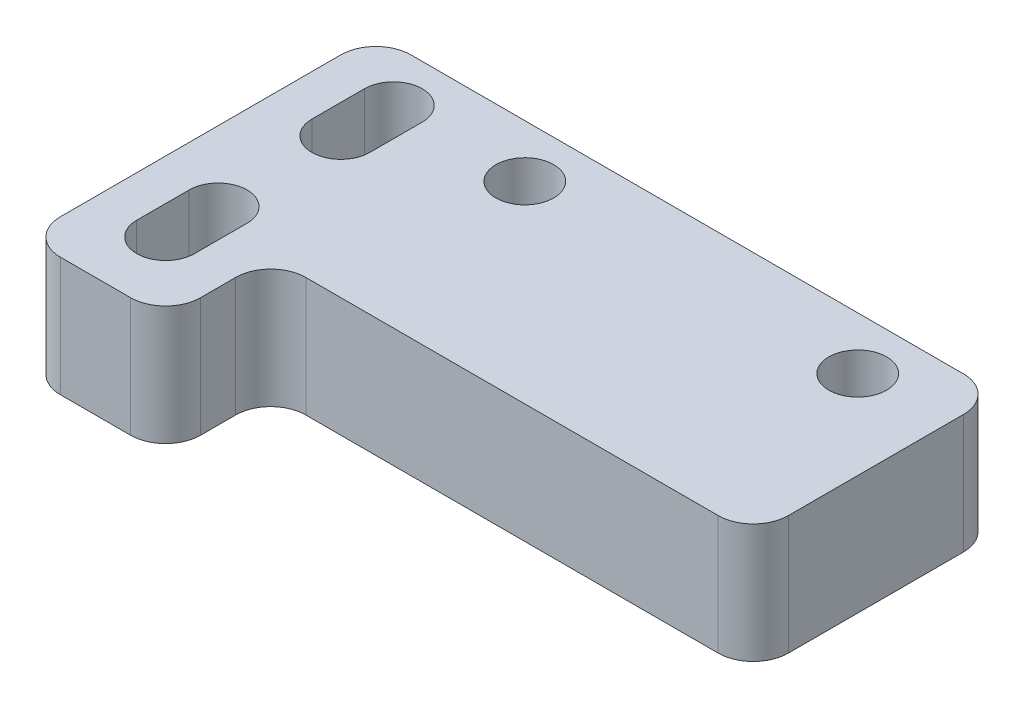
ISO-10303-21;
HEADER;
FILE_DESCRIPTION(('STEP AP214'),'2;1');
FILE_NAME('part.step','',(''),(''),'','','');
FILE_SCHEMA(('AUTOMOTIVE_DESIGN { 1 0 10303 214 1 1 1 1 }'));
ENDSEC;
DATA;
#1=APPLICATION_CONTEXT('core data for automotive mechanical design processes');
#2=APPLICATION_PROTOCOL_DEFINITION('international standard','automotive_design',2000,#1);
#3=PRODUCT_CONTEXT('',#1,'mechanical');
#4=PRODUCT('Part','Part','',(#3));
#5=PRODUCT_RELATED_PRODUCT_CATEGORY('part','',(#4));
#6=PRODUCT_DEFINITION_FORMATION('','',#4);
#7=PRODUCT_DEFINITION_CONTEXT('part definition',#1,'design');
#8=PRODUCT_DEFINITION('design','',#6,#7);
#9=PRODUCT_DEFINITION_SHAPE('','',#8);
#10=(LENGTH_UNIT() NAMED_UNIT(*) SI_UNIT(.MILLI.,.METRE.));
#11=(NAMED_UNIT(*) PLANE_ANGLE_UNIT() SI_UNIT($,.RADIAN.));
#12=(NAMED_UNIT(*) SI_UNIT($,.STERADIAN.) SOLID_ANGLE_UNIT());
#13=UNCERTAINTY_MEASURE_WITH_UNIT(LENGTH_MEASURE(1.E-05),#10,'distance_accuracy_value','');
#14=(GEOMETRIC_REPRESENTATION_CONTEXT(3) GLOBAL_UNCERTAINTY_ASSIGNED_CONTEXT((#13)) GLOBAL_UNIT_ASSIGNED_CONTEXT((#10,
#11,#12)) REPRESENTATION_CONTEXT('',''));
#15=CARTESIAN_POINT('',(0.,0.,0.));
#16=DIRECTION('',(0.,0.,1.));
#17=DIRECTION('',(1.,0.,0.));
#18=AXIS2_PLACEMENT_3D('',#15,#16,#17);
#19=CARTESIAN_POINT('',(0.,-3.4,8.));
#20=DIRECTION('',(0.,1.,0.));
#21=DIRECTION('',(0.,0.,1.));
#22=AXIS2_PLACEMENT_3D('',#19,#20,#21);
#23=PLANE('',#22);
#24=CARTESIAN_POINT('',(8.73,-3.4,-3.00000000000006));
#25=DIRECTION('',(0.,1.,0.));
#26=DIRECTION('',(0.,0.,1.));
#27=AXIS2_PLACEMENT_3D('',#24,#25,#26);
#28=CIRCLE('',#27,1.65);
#29=CARTESIAN_POINT('',(8.73,-3.4,-1.35000000000006));
#30=VERTEX_POINT('',#29);
#31=EDGE_CURVE('E279',#30,#30,#28,.T.);
#32=ORIENTED_EDGE('',*,*,#31,.T.);
#33=EDGE_LOOP('',(#32));
#34=FACE_BOUND('',#33,.T.);
#35=CARTESIAN_POINT('',(-10.27,-3.4,-3.00000000000007));
#36=DIRECTION('',(0.,1.,0.));
#37=DIRECTION('',(0.,0.,1.));
#38=AXIS2_PLACEMENT_3D('',#35,#36,#37);
#39=CIRCLE('',#38,1.65);
#40=CARTESIAN_POINT('',(-10.27,-3.4,-1.35000000000007));
#41=VERTEX_POINT('',#40);
#42=EDGE_CURVE('E270',#41,#41,#39,.T.);
#43=ORIENTED_EDGE('',*,*,#42,.T.);
#44=EDGE_LOOP('',(#43));
#45=FACE_BOUND('',#44,.T.);
#46=DIRECTION('',(0.,0.,1.));
#47=VECTOR('',#46,1.);
#48=CARTESIAN_POINT('',(-13.77,-3.4,-6.));
#49=LINE('',#48,#47);
#50=CARTESIAN_POINT('',(-13.77,-3.4,10.));
#51=VERTEX_POINT('',#50);
#52=CARTESIAN_POINT('',(-13.77,-3.4,12.));
#53=VERTEX_POINT('',#52);
#54=EDGE_CURVE('E391',#51,#53,#49,.T.);
#55=ORIENTED_EDGE('',*,*,#54,.T.);
#56=CARTESIAN_POINT('',(-15.77,-3.4,12.));
#57=DIRECTION('',(0.,1.,0.));
#58=DIRECTION('',(0.,0.,1.));
#59=AXIS2_PLACEMENT_3D('',#56,#57,#58);
#60=CIRCLE('',#59,2.);
#61=CARTESIAN_POINT('',(-15.77,-3.4,14.));
#62=VERTEX_POINT('',#61);
#63=EDGE_CURVE('E353',#53,#62,#60,.F.);
#64=ORIENTED_EDGE('',*,*,#63,.T.);
#65=DIRECTION('',(-1.,0.,0.));
#66=VECTOR('',#65,1.);
#67=CARTESIAN_POINT('',(-13.77,-3.4,14.));
#68=LINE('',#67,#66);
#69=CARTESIAN_POINT('',(-19.77,-3.4,14.));
#70=VERTEX_POINT('',#69);
#71=EDGE_CURVE('E398',#62,#70,#68,.T.);
#72=ORIENTED_EDGE('',*,*,#71,.T.);
#73=CARTESIAN_POINT('',(-19.77,-3.4,12.));
#74=DIRECTION('',(0.,1.,0.));
#75=DIRECTION('',(0.,0.,1.));
#76=AXIS2_PLACEMENT_3D('',#73,#74,#75);
#77=CIRCLE('',#76,2.);
#78=CARTESIAN_POINT('',(-21.77,-3.4,12.));
#79=VERTEX_POINT('',#78);
#80=EDGE_CURVE('E350',#70,#79,#77,.F.);
#81=ORIENTED_EDGE('',*,*,#80,.T.);
#82=DIRECTION('',(0.,0.,-1.));
#83=VECTOR('',#82,1.);
#84=CARTESIAN_POINT('',(-21.77,-3.4,-6.));
#85=LINE('',#84,#83);
#86=CARTESIAN_POINT('',(-21.77,-3.4,-4.));
#87=VERTEX_POINT('',#86);
#88=EDGE_CURVE('E406',#79,#87,#85,.T.);
#89=ORIENTED_EDGE('',*,*,#88,.T.);
#90=CARTESIAN_POINT('',(-19.77,-3.4,-4.));
#91=DIRECTION('',(0.,1.,0.));
#92=DIRECTION('',(0.,0.,1.));
#93=AXIS2_PLACEMENT_3D('',#90,#91,#92);
#94=CIRCLE('',#93,2.);
#95=CARTESIAN_POINT('',(-19.77,-3.4,-6.));
#96=VERTEX_POINT('',#95);
#97=EDGE_CURVE('E347',#87,#96,#94,.F.);
#98=ORIENTED_EDGE('',*,*,#97,.T.);
#99=DIRECTION('',(-1.,0.,0.));
#100=VECTOR('',#99,1.);
#101=CARTESIAN_POINT('',(13.77,-3.4,-6.));
#102=LINE('',#101,#100);
#103=CARTESIAN_POINT('',(11.77,-3.4,-6.));
#104=VERTEX_POINT('',#103);
#105=EDGE_CURVE('E283',#104,#96,#102,.T.);
#106=ORIENTED_EDGE('',*,*,#105,.F.);
#107=CARTESIAN_POINT('',(11.77,-3.4,-4.));
#108=DIRECTION('',(0.,1.,0.));
#109=DIRECTION('',(0.,0.,1.));
#110=AXIS2_PLACEMENT_3D('',#107,#108,#109);
#111=CIRCLE('',#110,2.);
#112=CARTESIAN_POINT('',(13.77,-3.4,-4.));
#113=VERTEX_POINT('',#112);
#114=EDGE_CURVE('E58',#104,#113,#111,.F.);
#115=ORIENTED_EDGE('',*,*,#114,.T.);
#116=DIRECTION('',(0.,0.,-1.));
#117=VECTOR('',#116,1.);
#118=CARTESIAN_POINT('',(13.77,-3.4,8.));
#119=LINE('',#118,#117);
#120=CARTESIAN_POINT('',(13.77,-3.4,6.));
#121=VERTEX_POINT('',#120);
#122=EDGE_CURVE('E303',#121,#113,#119,.T.);
#123=ORIENTED_EDGE('',*,*,#122,.F.);
#124=CARTESIAN_POINT('',(11.77,-3.4,6.));
#125=DIRECTION('',(0.,1.,0.));
#126=DIRECTION('',(0.,0.,1.));
#127=AXIS2_PLACEMENT_3D('',#124,#125,#126);
#128=CIRCLE('',#127,2.);
#129=CARTESIAN_POINT('',(11.77,-3.4,8.));
#130=VERTEX_POINT('',#129);
#131=EDGE_CURVE('E342',#121,#130,#128,.F.);
#132=ORIENTED_EDGE('',*,*,#131,.T.);
#133=DIRECTION('',(1.,0.,0.));
#134=VECTOR('',#133,1.);
#135=CARTESIAN_POINT('',(0.,-3.4,8.));
#136=LINE('',#135,#134);
#137=CARTESIAN_POINT('',(-11.77,-3.4,8.));
#138=VERTEX_POINT('',#137);
#139=EDGE_CURVE('E291',#138,#130,#136,.T.);
#140=ORIENTED_EDGE('',*,*,#139,.F.);
#141=CARTESIAN_POINT('',(-11.77,-3.4,10.));
#142=DIRECTION('',(0.,1.,0.));
#143=DIRECTION('',(0.,0.,1.));
#144=AXIS2_PLACEMENT_3D('',#141,#142,#143);
#145=CIRCLE('',#144,2.);
#146=EDGE_CURVE('E11',#138,#51,#145,.T.);
#147=ORIENTED_EDGE('',*,*,#146,.T.);
#148=EDGE_LOOP('',(#55,#64,#72,#81,#89,#98,#106,#115,#123,#132,#140,#147));
#149=FACE_BOUND('',#148,.T.);
#150=DIRECTION('',(0.,0.,-1.));
#151=VECTOR('',#150,1.);
#152=CARTESIAN_POINT('',(-19.42,-3.4,7.));
#153=LINE('',#152,#151);
#154=CARTESIAN_POINT('',(-19.42,-3.4,10.));
#155=VERTEX_POINT('',#154);
#156=CARTESIAN_POINT('',(-19.42,-3.4,7.));
#157=VERTEX_POINT('',#156);
#158=EDGE_CURVE('E262',#155,#157,#153,.T.);
#159=ORIENTED_EDGE('',*,*,#158,.F.);
#160=CARTESIAN_POINT('',(-17.77,-3.4,10.));
#161=DIRECTION('',(0.,1.,0.));
#162=DIRECTION('',(0.,0.,1.));
#163=AXIS2_PLACEMENT_3D('',#160,#161,#162);
#164=CIRCLE('',#163,1.65);
#165=CARTESIAN_POINT('',(-16.12,-3.4,10.));
#166=VERTEX_POINT('',#165);
#167=EDGE_CURVE('E188',#166,#155,#164,.F.);
#168=ORIENTED_EDGE('',*,*,#167,.F.);
#169=DIRECTION('',(0.,0.,1.));
#170=VECTOR('',#169,1.);
#171=CARTESIAN_POINT('',(-16.12,-3.4,7.));
#172=LINE('',#171,#170);
#173=CARTESIAN_POINT('',(-16.12,-3.4,7.));
#174=VERTEX_POINT('',#173);
#175=EDGE_CURVE('E403',#174,#166,#172,.T.);
#176=ORIENTED_EDGE('',*,*,#175,.F.);
#177=CARTESIAN_POINT('',(-17.77,-3.4,7.));
#178=DIRECTION('',(0.,1.,0.));
#179=DIRECTION('',(0.,0.,1.));
#180=AXIS2_PLACEMENT_3D('',#177,#178,#179);
#181=CIRCLE('',#180,1.65);
#182=EDGE_CURVE('E397',#157,#174,#181,.F.);
#183=ORIENTED_EDGE('',*,*,#182,.F.);
#184=EDGE_LOOP('',(#159,#168,#176,#183));
#185=FACE_BOUND('',#184,.T.);
#186=DIRECTION('',(0.,0.,-1.));
#187=VECTOR('',#186,1.);
#188=CARTESIAN_POINT('',(-19.42,-3.4,-3.));
#189=LINE('',#188,#187);
#190=CARTESIAN_POINT('',(-19.42,-3.4,0.));
#191=VERTEX_POINT('',#190);
#192=CARTESIAN_POINT('',(-19.42,-3.4,-3.));
#193=VERTEX_POINT('',#192);
#194=EDGE_CURVE('E265',#191,#193,#189,.T.);
#195=ORIENTED_EDGE('',*,*,#194,.F.);
#196=CARTESIAN_POINT('',(-17.77,-3.4,0.));
#197=DIRECTION('',(0.,1.,0.));
#198=DIRECTION('',(0.,0.,1.));
#199=AXIS2_PLACEMENT_3D('',#196,#197,#198);
#200=CIRCLE('',#199,1.65);
#201=CARTESIAN_POINT('',(-16.12,-3.4,0.));
#202=VERTEX_POINT('',#201);
#203=EDGE_CURVE('E275',#202,#191,#200,.F.);
#204=ORIENTED_EDGE('',*,*,#203,.F.);
#205=DIRECTION('',(0.,0.,1.));
#206=VECTOR('',#205,1.);
#207=CARTESIAN_POINT('',(-16.12,-3.4,-3.));
#208=LINE('',#207,#206);
#209=CARTESIAN_POINT('',(-16.12,-3.4,-3.));
#210=VERTEX_POINT('',#209);
#211=EDGE_CURVE('E428',#210,#202,#208,.T.);
#212=ORIENTED_EDGE('',*,*,#211,.F.);
#213=CARTESIAN_POINT('',(-17.77,-3.4,-3.));
#214=DIRECTION('',(0.,1.,0.));
#215=DIRECTION('',(0.,0.,1.));
#216=AXIS2_PLACEMENT_3D('',#213,#214,#215);
#217=CIRCLE('',#216,1.65);
#218=EDGE_CURVE('E419',#193,#210,#217,.F.);
#219=ORIENTED_EDGE('',*,*,#218,.F.);
#220=EDGE_LOOP('',(#195,#204,#212,#219));
#221=FACE_BOUND('',#220,.T.);
#222=ADVANCED_FACE('F42',(#34,#45,#149,#185,#221),#23,.F.);
#223=CARTESIAN_POINT('',(13.77,0.,8.));
#224=DIRECTION('',(-1.,0.,0.));
#225=DIRECTION('',(0.,0.,1.));
#226=AXIS2_PLACEMENT_3D('',#223,#224,#225);
#227=PLANE('',#226);
#228=ORIENTED_EDGE('',*,*,#122,.T.);
#229=DIRECTION('',(0.,-1.,0.));
#230=VECTOR('',#229,1.);
#231=CARTESIAN_POINT('',(13.77,3.4,-4.));
#232=LINE('',#231,#230);
#233=CARTESIAN_POINT('',(13.77,3.4,-4.));
#234=VERTEX_POINT('',#233);
#235=EDGE_CURVE('E373',#113,#234,#232,.F.);
#236=ORIENTED_EDGE('',*,*,#235,.T.);
#237=DIRECTION('',(0.,0.,-1.));
#238=VECTOR('',#237,1.);
#239=CARTESIAN_POINT('',(13.77,3.4,8.));
#240=LINE('',#239,#238);
#241=CARTESIAN_POINT('',(13.77,3.4,6.));
#242=VERTEX_POINT('',#241);
#243=EDGE_CURVE('E299',#242,#234,#240,.T.);
#244=ORIENTED_EDGE('',*,*,#243,.F.);
#245=DIRECTION('',(0.,1.,0.));
#246=VECTOR('',#245,1.);
#247=CARTESIAN_POINT('',(13.77,-3.4,6.));
#248=LINE('',#247,#246);
#249=EDGE_CURVE('E65',#242,#121,#248,.F.);
#250=ORIENTED_EDGE('',*,*,#249,.T.);
#251=EDGE_LOOP('',(#228,#236,#244,#250));
#252=FACE_BOUND('',#251,.T.);
#253=ADVANCED_FACE('F454',(#252),#227,.F.);
#254=CARTESIAN_POINT('',(0.,3.4,8.));
#255=DIRECTION('',(0.,1.,0.));
#256=DIRECTION('',(0.,0.,1.));
#257=AXIS2_PLACEMENT_3D('',#254,#255,#256);
#258=PLANE('',#257);
#259=CARTESIAN_POINT('',(8.73,3.4,-3.00000000000006));
#260=DIRECTION('',(0.,-1.,0.));
#261=DIRECTION('',(0.,0.,-1.));
#262=AXIS2_PLACEMENT_3D('',#259,#260,#261);
#263=CIRCLE('',#262,1.65);
#264=CARTESIAN_POINT('',(8.73,3.4,-4.65000000000006));
#265=VERTEX_POINT('',#264);
#266=EDGE_CURVE('E266',#265,#265,#263,.T.);
#267=ORIENTED_EDGE('',*,*,#266,.T.);
#268=EDGE_LOOP('',(#267));
#269=FACE_BOUND('',#268,.T.);
#270=CARTESIAN_POINT('',(-10.27,3.4,-3.00000000000007));
#271=DIRECTION('',(0.,-1.,0.));
#272=DIRECTION('',(0.,0.,-1.));
#273=AXIS2_PLACEMENT_3D('',#270,#271,#272);
#274=CIRCLE('',#273,1.65);
#275=CARTESIAN_POINT('',(-10.27,3.4,-4.65000000000007));
#276=VERTEX_POINT('',#275);
#277=EDGE_CURVE('E271',#276,#276,#274,.T.);
#278=ORIENTED_EDGE('',*,*,#277,.T.);
#279=EDGE_LOOP('',(#278));
#280=FACE_BOUND('',#279,.T.);
#281=DIRECTION('',(1.,0.,0.));
#282=VECTOR('',#281,1.);
#283=CARTESIAN_POINT('',(-13.77,3.4,14.));
#284=LINE('',#283,#282);
#285=CARTESIAN_POINT('',(-19.77,3.4,14.));
#286=VERTEX_POINT('',#285);
#287=CARTESIAN_POINT('',(-15.77,3.4,14.));
#288=VERTEX_POINT('',#287);
#289=EDGE_CURVE('E258',#286,#288,#284,.T.);
#290=ORIENTED_EDGE('',*,*,#289,.T.);
#291=CARTESIAN_POINT('',(-15.77,3.4,12.));
#292=DIRECTION('',(0.,1.,0.));
#293=DIRECTION('',(0.,0.,1.));
#294=AXIS2_PLACEMENT_3D('',#291,#292,#293);
#295=CIRCLE('',#294,2.);
#296=CARTESIAN_POINT('',(-13.77,3.4,12.));
#297=VERTEX_POINT('',#296);
#298=EDGE_CURVE('E339',#288,#297,#295,.T.);
#299=ORIENTED_EDGE('',*,*,#298,.T.);
#300=DIRECTION('',(0.,0.,-1.));
#301=VECTOR('',#300,1.);
#302=CARTESIAN_POINT('',(-13.77,3.4,-6.));
#303=LINE('',#302,#301);
#304=CARTESIAN_POINT('',(-13.77,3.4,10.));
#305=VERTEX_POINT('',#304);
#306=EDGE_CURVE('E242',#297,#305,#303,.T.);
#307=ORIENTED_EDGE('',*,*,#306,.T.);
#308=CARTESIAN_POINT('',(-11.77,3.4,10.));
#309=DIRECTION('',(0.,1.,0.));
#310=DIRECTION('',(0.,0.,1.));
#311=AXIS2_PLACEMENT_3D('',#308,#309,#310);
#312=CIRCLE('',#311,2.);
#313=CARTESIAN_POINT('',(-11.77,3.4,8.));
#314=VERTEX_POINT('',#313);
#315=EDGE_CURVE('E51',#305,#314,#312,.F.);
#316=ORIENTED_EDGE('',*,*,#315,.T.);
#317=DIRECTION('',(1.,0.,0.));
#318=VECTOR('',#317,1.);
#319=CARTESIAN_POINT('',(0.,3.4,8.));
#320=LINE('',#319,#318);
#321=CARTESIAN_POINT('',(11.77,3.4,8.));
#322=VERTEX_POINT('',#321);
#323=EDGE_CURVE('E295',#314,#322,#320,.T.);
#324=ORIENTED_EDGE('',*,*,#323,.T.);
#325=CARTESIAN_POINT('',(11.77,3.4,6.));
#326=DIRECTION('',(0.,1.,0.));
#327=DIRECTION('',(0.,0.,1.));
#328=AXIS2_PLACEMENT_3D('',#325,#326,#327);
#329=CIRCLE('',#328,2.);
#330=EDGE_CURVE('E327',#322,#242,#329,.T.);
#331=ORIENTED_EDGE('',*,*,#330,.T.);
#332=ORIENTED_EDGE('',*,*,#243,.T.);
#333=CARTESIAN_POINT('',(11.77,3.4,-4.));
#334=DIRECTION('',(0.,1.,0.));
#335=DIRECTION('',(0.,0.,1.));
#336=AXIS2_PLACEMENT_3D('',#333,#334,#335);
#337=CIRCLE('',#336,2.);
#338=CARTESIAN_POINT('',(11.77,3.4,-6.));
#339=VERTEX_POINT('',#338);
#340=EDGE_CURVE('E330',#234,#339,#337,.T.);
#341=ORIENTED_EDGE('',*,*,#340,.T.);
#342=DIRECTION('',(1.,0.,0.));
#343=VECTOR('',#342,1.);
#344=CARTESIAN_POINT('',(-13.77,3.4,-6.));
#345=LINE('',#344,#343);
#346=CARTESIAN_POINT('',(-19.77,3.4,-6.));
#347=VERTEX_POINT('',#346);
#348=EDGE_CURVE('E287',#347,#339,#345,.T.);
#349=ORIENTED_EDGE('',*,*,#348,.F.);
#350=CARTESIAN_POINT('',(-19.77,3.4,-4.));
#351=DIRECTION('',(0.,1.,0.));
#352=DIRECTION('',(0.,0.,1.));
#353=AXIS2_PLACEMENT_3D('',#350,#351,#352);
#354=CIRCLE('',#353,2.);
#355=CARTESIAN_POINT('',(-21.77,3.4,-4.));
#356=VERTEX_POINT('',#355);
#357=EDGE_CURVE('E333',#347,#356,#354,.T.);
#358=ORIENTED_EDGE('',*,*,#357,.T.);
#359=DIRECTION('',(0.,0.,1.));
#360=VECTOR('',#359,1.);
#361=CARTESIAN_POINT('',(-21.77,3.4,-6.));
#362=LINE('',#361,#360);
#363=CARTESIAN_POINT('',(-21.77,3.4,12.));
#364=VERTEX_POINT('',#363);
#365=EDGE_CURVE('E254',#356,#364,#362,.T.);
#366=ORIENTED_EDGE('',*,*,#365,.T.);
#367=CARTESIAN_POINT('',(-19.77,3.4,12.));
#368=DIRECTION('',(0.,1.,0.));
#369=DIRECTION('',(0.,0.,1.));
#370=AXIS2_PLACEMENT_3D('',#367,#368,#369);
#371=CIRCLE('',#370,2.);
#372=EDGE_CURVE('E336',#364,#286,#371,.T.);
#373=ORIENTED_EDGE('',*,*,#372,.T.);
#374=EDGE_LOOP('',(#290,#299,#307,#316,#324,#331,#332,#341,#349,#358,#366,#373));
#375=FACE_BOUND('',#374,.T.);
#376=DIRECTION('',(0.,0.,1.));
#377=VECTOR('',#376,1.);
#378=CARTESIAN_POINT('',(-19.42,3.4,7.));
#379=LINE('',#378,#377);
#380=CARTESIAN_POINT('',(-19.42,3.4,7.));
#381=VERTEX_POINT('',#380);
#382=CARTESIAN_POINT('',(-19.42,3.4,10.));
#383=VERTEX_POINT('',#382);
#384=EDGE_CURVE('E196',#381,#383,#379,.T.);
#385=ORIENTED_EDGE('',*,*,#384,.F.);
#386=CARTESIAN_POINT('',(-17.77,3.4,7.));
#387=DIRECTION('',(0.,1.,0.));
#388=DIRECTION('',(0.,0.,1.));
#389=AXIS2_PLACEMENT_3D('',#386,#387,#388);
#390=CIRCLE('',#389,1.65);
#391=CARTESIAN_POINT('',(-16.12,3.4,7.));
#392=VERTEX_POINT('',#391);
#393=EDGE_CURVE('E203',#392,#381,#390,.T.);
#394=ORIENTED_EDGE('',*,*,#393,.F.);
#395=DIRECTION('',(0.,0.,-1.));
#396=VECTOR('',#395,1.);
#397=CARTESIAN_POINT('',(-16.12,3.4,7.));
#398=LINE('',#397,#396);
#399=CARTESIAN_POINT('',(-16.12,3.4,10.));
#400=VERTEX_POINT('',#399);
#401=EDGE_CURVE('E208',#400,#392,#398,.T.);
#402=ORIENTED_EDGE('',*,*,#401,.F.);
#403=CARTESIAN_POINT('',(-17.77,3.4,10.));
#404=DIRECTION('',(0.,1.,0.));
#405=DIRECTION('',(0.,0.,1.));
#406=AXIS2_PLACEMENT_3D('',#403,#404,#405);
#407=CIRCLE('',#406,1.65);
#408=EDGE_CURVE('E186',#383,#400,#407,.T.);
#409=ORIENTED_EDGE('',*,*,#408,.F.);
#410=EDGE_LOOP('',(#385,#394,#402,#409));
#411=FACE_BOUND('',#410,.T.);
#412=DIRECTION('',(0.,0.,1.));
#413=VECTOR('',#412,1.);
#414=CARTESIAN_POINT('',(-19.42,3.4,-3.));
#415=LINE('',#414,#413);
#416=CARTESIAN_POINT('',(-19.42,3.4,-3.));
#417=VERTEX_POINT('',#416);
#418=CARTESIAN_POINT('',(-19.42,3.4,0.));
#419=VERTEX_POINT('',#418);
#420=EDGE_CURVE('E226',#417,#419,#415,.T.);
#421=ORIENTED_EDGE('',*,*,#420,.F.);
#422=CARTESIAN_POINT('',(-17.77,3.4,-3.));
#423=DIRECTION('',(0.,1.,0.));
#424=DIRECTION('',(0.,0.,1.));
#425=AXIS2_PLACEMENT_3D('',#422,#423,#424);
#426=CIRCLE('',#425,1.65);
#427=CARTESIAN_POINT('',(-16.12,3.4,-3.));
#428=VERTEX_POINT('',#427);
#429=EDGE_CURVE('E218',#428,#417,#426,.T.);
#430=ORIENTED_EDGE('',*,*,#429,.F.);
#431=DIRECTION('',(0.,0.,-1.));
#432=VECTOR('',#431,1.);
#433=CARTESIAN_POINT('',(-16.12,3.4,-3.));
#434=LINE('',#433,#432);
#435=CARTESIAN_POINT('',(-16.12,3.4,0.));
#436=VERTEX_POINT('',#435);
#437=EDGE_CURVE('E234',#436,#428,#434,.T.);
#438=ORIENTED_EDGE('',*,*,#437,.F.);
#439=CARTESIAN_POINT('',(-17.77,3.4,0.));
#440=DIRECTION('',(0.,1.,0.));
#441=DIRECTION('',(0.,0.,1.));
#442=AXIS2_PLACEMENT_3D('',#439,#440,#441);
#443=CIRCLE('',#442,1.65);
#444=EDGE_CURVE('E230',#419,#436,#443,.T.);
#445=ORIENTED_EDGE('',*,*,#444,.F.);
#446=EDGE_LOOP('',(#421,#430,#438,#445));
#447=FACE_BOUND('',#446,.T.);
#448=ADVANCED_FACE('F205',(#269,#280,#375,#411,#447),#258,.T.);
#449=CARTESIAN_POINT('',(0.,0.,8.));
#450=DIRECTION('',(0.,0.,1.));
#451=DIRECTION('',(1.,0.,0.));
#452=AXIS2_PLACEMENT_3D('',#449,#450,#451);
#453=PLANE('',#452);
#454=ORIENTED_EDGE('',*,*,#323,.F.);
#455=DIRECTION('',(0.,1.,0.));
#456=VECTOR('',#455,1.);
#457=CARTESIAN_POINT('',(-11.77,-3.4,8.));
#458=LINE('',#457,#456);
#459=EDGE_CURVE('E317',#314,#138,#458,.F.);
#460=ORIENTED_EDGE('',*,*,#459,.T.);
#461=ORIENTED_EDGE('',*,*,#139,.T.);
#462=DIRECTION('',(0.,1.,0.));
#463=VECTOR('',#462,1.);
#464=CARTESIAN_POINT('',(11.77,3.4,8.));
#465=LINE('',#464,#463);
#466=EDGE_CURVE('E313',#130,#322,#465,.T.);
#467=ORIENTED_EDGE('',*,*,#466,.T.);
#468=EDGE_LOOP('',(#454,#460,#461,#467));
#469=FACE_BOUND('',#468,.T.);
#470=ADVANCED_FACE('F383',(#469),#453,.T.);
#471=CARTESIAN_POINT('',(0.,0.,-6.));
#472=DIRECTION('',(0.,0.,-1.));
#473=DIRECTION('',(-1.,0.,0.));
#474=AXIS2_PLACEMENT_3D('',#471,#472,#473);
#475=PLANE('',#474);
#476=ORIENTED_EDGE('',*,*,#105,.T.);
#477=DIRECTION('',(0.,1.,0.));
#478=VECTOR('',#477,1.);
#479=CARTESIAN_POINT('',(-19.77,0.,-6.));
#480=LINE('',#479,#478);
#481=EDGE_CURVE('E367',#96,#347,#480,.T.);
#482=ORIENTED_EDGE('',*,*,#481,.T.);
#483=ORIENTED_EDGE('',*,*,#348,.T.);
#484=DIRECTION('',(0.,-1.,0.));
#485=VECTOR('',#484,1.);
#486=CARTESIAN_POINT('',(11.77,-3.4,-6.));
#487=LINE('',#486,#485);
#488=EDGE_CURVE('E363',#339,#104,#487,.T.);
#489=ORIENTED_EDGE('',*,*,#488,.T.);
#490=EDGE_LOOP('',(#476,#482,#483,#489));
#491=FACE_BOUND('',#490,.T.);
#492=ADVANCED_FACE('F447',(#491),#475,.T.);
#493=CARTESIAN_POINT('',(-10.27,3.4,-3.00000000000007));
#494=DIRECTION('',(0.,-1.,0.));
#495=DIRECTION('',(0.,0.,-1.));
#496=AXIS2_PLACEMENT_3D('',#493,#494,#495);
#497=CYLINDRICAL_SURFACE('',#496,1.65);
#498=ORIENTED_EDGE('',*,*,#277,.F.);
#499=EDGE_LOOP('',(#498));
#500=FACE_BOUND('',#499,.T.);
#501=ORIENTED_EDGE('',*,*,#42,.F.);
#502=EDGE_LOOP('',(#501));
#503=FACE_BOUND('',#502,.T.);
#504=ADVANCED_FACE('F611',(#500,#503),#497,.F.);
#505=CARTESIAN_POINT('',(8.73,3.4,-3.00000000000006));
#506=DIRECTION('',(0.,-1.,0.));
#507=DIRECTION('',(0.,0.,-1.));
#508=AXIS2_PLACEMENT_3D('',#505,#506,#507);
#509=CYLINDRICAL_SURFACE('',#508,1.65);
#510=ORIENTED_EDGE('',*,*,#266,.F.);
#511=EDGE_LOOP('',(#510));
#512=FACE_BOUND('',#511,.T.);
#513=ORIENTED_EDGE('',*,*,#31,.F.);
#514=EDGE_LOOP('',(#513));
#515=FACE_BOUND('',#514,.T.);
#516=ADVANCED_FACE('F602',(#512,#515),#509,.F.);
#517=CARTESIAN_POINT('',(-21.77,-24.940659228538,-6.));
#518=DIRECTION('',(-1.,0.,0.));
#519=DIRECTION('',(0.,0.,1.));
#520=AXIS2_PLACEMENT_3D('',#517,#518,#519);
#521=PLANE('',#520);
#522=ORIENTED_EDGE('',*,*,#88,.F.);
#523=DIRECTION('',(0.,1.,0.));
#524=VECTOR('',#523,1.);
#525=CARTESIAN_POINT('',(-21.77,-24.940659228538,12.));
#526=LINE('',#525,#524);
#527=EDGE_CURVE('E359',#79,#364,#526,.T.);
#528=ORIENTED_EDGE('',*,*,#527,.T.);
#529=ORIENTED_EDGE('',*,*,#365,.F.);
#530=DIRECTION('',(0.,1.,0.));
#531=VECTOR('',#530,1.);
#532=CARTESIAN_POINT('',(-21.77,-24.940659228538,-4.));
#533=LINE('',#532,#531);
#534=EDGE_CURVE('E356',#356,#87,#533,.F.);
#535=ORIENTED_EDGE('',*,*,#534,.T.);
#536=EDGE_LOOP('',(#522,#528,#529,#535));
#537=FACE_BOUND('',#536,.T.);
#538=ADVANCED_FACE('F593',(#537),#521,.T.);
#539=CARTESIAN_POINT('',(-13.77,-24.940659228538,14.));
#540=DIRECTION('',(0.,0.,1.));
#541=DIRECTION('',(1.,0.,0.));
#542=AXIS2_PLACEMENT_3D('',#539,#540,#541);
#543=PLANE('',#542);
#544=ORIENTED_EDGE('',*,*,#71,.F.);
#545=DIRECTION('',(0.,1.,0.));
#546=VECTOR('',#545,1.);
#547=CARTESIAN_POINT('',(-15.77,-24.940659228538,14.));
#548=LINE('',#547,#546);
#549=EDGE_CURVE('E323',#62,#288,#548,.T.);
#550=ORIENTED_EDGE('',*,*,#549,.T.);
#551=ORIENTED_EDGE('',*,*,#289,.F.);
#552=DIRECTION('',(0.,1.,0.));
#553=VECTOR('',#552,1.);
#554=CARTESIAN_POINT('',(-19.77,-24.940659228538,14.));
#555=LINE('',#554,#553);
#556=EDGE_CURVE('E320',#286,#70,#555,.F.);
#557=ORIENTED_EDGE('',*,*,#556,.T.);
#558=EDGE_LOOP('',(#544,#550,#551,#557));
#559=FACE_BOUND('',#558,.T.);
#560=ADVANCED_FACE('F585',(#559),#543,.T.);
#561=CARTESIAN_POINT('',(-13.77,-24.940659228538,-6.));
#562=DIRECTION('',(1.,0.,0.));
#563=DIRECTION('',(0.,0.,-1.));
#564=AXIS2_PLACEMENT_3D('',#561,#562,#563);
#565=PLANE('',#564);
#566=ORIENTED_EDGE('',*,*,#54,.F.);
#567=DIRECTION('',(0.,1.,0.));
#568=VECTOR('',#567,1.);
#569=CARTESIAN_POINT('',(-13.77,3.4,10.));
#570=LINE('',#569,#568);
#571=EDGE_CURVE('E309',#51,#305,#570,.T.);
#572=ORIENTED_EDGE('',*,*,#571,.T.);
#573=ORIENTED_EDGE('',*,*,#306,.F.);
#574=DIRECTION('',(0.,1.,0.));
#575=VECTOR('',#574,1.);
#576=CARTESIAN_POINT('',(-13.77,-24.940659228538,12.));
#577=LINE('',#576,#575);
#578=EDGE_CURVE('E306',#297,#53,#577,.F.);
#579=ORIENTED_EDGE('',*,*,#578,.T.);
#580=EDGE_LOOP('',(#566,#572,#573,#579));
#581=FACE_BOUND('',#580,.T.);
#582=ADVANCED_FACE('F394',(#581),#565,.T.);
#583=CARTESIAN_POINT('',(-19.42,-24.940659228538,-3.));
#584=DIRECTION('',(-1.,0.,0.));
#585=DIRECTION('',(0.,0.,1.));
#586=AXIS2_PLACEMENT_3D('',#583,#584,#585);
#587=PLANE('',#586);
#588=DIRECTION('',(0.,1.,0.));
#589=VECTOR('',#588,1.);
#590=CARTESIAN_POINT('',(-19.42,-24.940659228538,0.));
#591=LINE('',#590,#589);
#592=EDGE_CURVE('E246',#191,#419,#591,.T.);
#593=ORIENTED_EDGE('',*,*,#592,.F.);
#594=ORIENTED_EDGE('',*,*,#194,.T.);
#595=DIRECTION('',(0.,1.,0.));
#596=VECTOR('',#595,1.);
#597=CARTESIAN_POINT('',(-19.42,-24.940659228538,-3.));
#598=LINE('',#597,#596);
#599=EDGE_CURVE('E238',#193,#417,#598,.T.);
#600=ORIENTED_EDGE('',*,*,#599,.T.);
#601=ORIENTED_EDGE('',*,*,#420,.T.);
#602=EDGE_LOOP('',(#593,#594,#600,#601));
#603=FACE_BOUND('',#602,.T.);
#604=ADVANCED_FACE('F568',(#603),#587,.F.);
#605=CARTESIAN_POINT('',(-17.77,-24.940659228538,0.));
#606=DIRECTION('',(0.,1.,0.));
#607=DIRECTION('',(0.,0.,1.));
#608=AXIS2_PLACEMENT_3D('',#605,#606,#607);
#609=CYLINDRICAL_SURFACE('',#608,1.65);
#610=DIRECTION('',(0.,1.,0.));
#611=VECTOR('',#610,1.);
#612=CARTESIAN_POINT('',(-16.12,-24.940659228538,0.));
#613=LINE('',#612,#611);
#614=EDGE_CURVE('E243',#202,#436,#613,.T.);
#615=ORIENTED_EDGE('',*,*,#614,.F.);
#616=ORIENTED_EDGE('',*,*,#203,.T.);
#617=ORIENTED_EDGE('',*,*,#592,.T.);
#618=ORIENTED_EDGE('',*,*,#444,.T.);
#619=EDGE_LOOP('',(#615,#616,#617,#618));
#620=FACE_BOUND('',#619,.T.);
#621=ADVANCED_FACE('F559',(#620),#609,.F.);
#622=CARTESIAN_POINT('',(-16.12,-24.940659228538,-3.));
#623=DIRECTION('',(1.,0.,0.));
#624=DIRECTION('',(0.,0.,-1.));
#625=AXIS2_PLACEMENT_3D('',#622,#623,#624);
#626=PLANE('',#625);
#627=DIRECTION('',(0.,1.,0.));
#628=VECTOR('',#627,1.);
#629=CARTESIAN_POINT('',(-16.12,-24.940659228538,-3.));
#630=LINE('',#629,#628);
#631=EDGE_CURVE('E239',#210,#428,#630,.T.);
#632=ORIENTED_EDGE('',*,*,#631,.F.);
#633=ORIENTED_EDGE('',*,*,#211,.T.);
#634=ORIENTED_EDGE('',*,*,#614,.T.);
#635=ORIENTED_EDGE('',*,*,#437,.T.);
#636=EDGE_LOOP('',(#632,#633,#634,#635));
#637=FACE_BOUND('',#636,.T.);
#638=ADVANCED_FACE('F550',(#637),#626,.F.);
#639=CARTESIAN_POINT('',(-17.77,-24.940659228538,-3.));
#640=DIRECTION('',(0.,1.,0.));
#641=DIRECTION('',(0.,0.,1.));
#642=AXIS2_PLACEMENT_3D('',#639,#640,#641);
#643=CYLINDRICAL_SURFACE('',#642,1.65);
#644=ORIENTED_EDGE('',*,*,#599,.F.);
#645=ORIENTED_EDGE('',*,*,#218,.T.);
#646=ORIENTED_EDGE('',*,*,#631,.T.);
#647=ORIENTED_EDGE('',*,*,#429,.T.);
#648=EDGE_LOOP('',(#644,#645,#646,#647));
#649=FACE_BOUND('',#648,.T.);
#650=ADVANCED_FACE('F542',(#649),#643,.F.);
#651=CARTESIAN_POINT('',(-19.42,-24.940659228538,7.));
#652=DIRECTION('',(-1.,0.,0.));
#653=DIRECTION('',(0.,0.,1.));
#654=AXIS2_PLACEMENT_3D('',#651,#652,#653);
#655=PLANE('',#654);
#656=DIRECTION('',(0.,1.,0.));
#657=VECTOR('',#656,1.);
#658=CARTESIAN_POINT('',(-19.42,-24.940659228538,10.));
#659=LINE('',#658,#657);
#660=EDGE_CURVE('E181',#155,#383,#659,.T.);
#661=ORIENTED_EDGE('',*,*,#660,.F.);
#662=ORIENTED_EDGE('',*,*,#158,.T.);
#663=DIRECTION('',(0.,1.,0.));
#664=VECTOR('',#663,1.);
#665=CARTESIAN_POINT('',(-19.42,-24.940659228538,7.));
#666=LINE('',#665,#664);
#667=EDGE_CURVE('E193',#157,#381,#666,.T.);
#668=ORIENTED_EDGE('',*,*,#667,.T.);
#669=ORIENTED_EDGE('',*,*,#384,.T.);
#670=EDGE_LOOP('',(#661,#662,#668,#669));
#671=FACE_BOUND('',#670,.T.);
#672=ADVANCED_FACE('F197',(#671),#655,.F.);
#673=CARTESIAN_POINT('',(-17.77,-24.940659228538,10.));
#674=DIRECTION('',(0.,1.,0.));
#675=DIRECTION('',(0.,0.,1.));
#676=AXIS2_PLACEMENT_3D('',#673,#674,#675);
#677=CYLINDRICAL_SURFACE('',#676,1.65);
#678=DIRECTION('',(0.,1.,0.));
#679=VECTOR('',#678,1.);
#680=CARTESIAN_POINT('',(-16.12,-24.940659228538,10.));
#681=LINE('',#680,#679);
#682=EDGE_CURVE('E192',#166,#400,#681,.T.);
#683=ORIENTED_EDGE('',*,*,#682,.F.);
#684=ORIENTED_EDGE('',*,*,#167,.T.);
#685=ORIENTED_EDGE('',*,*,#660,.T.);
#686=ORIENTED_EDGE('',*,*,#408,.T.);
#687=EDGE_LOOP('',(#683,#684,#685,#686));
#688=FACE_BOUND('',#687,.T.);
#689=ADVANCED_FACE('F184',(#688),#677,.F.);
#690=CARTESIAN_POINT('',(-16.12,-24.940659228538,7.));
#691=DIRECTION('',(1.,0.,0.));
#692=DIRECTION('',(0.,0.,-1.));
#693=AXIS2_PLACEMENT_3D('',#690,#691,#692);
#694=PLANE('',#693);
#695=DIRECTION('',(0.,1.,0.));
#696=VECTOR('',#695,1.);
#697=CARTESIAN_POINT('',(-16.12,-24.940659228538,7.));
#698=LINE('',#697,#696);
#699=EDGE_CURVE('E215',#174,#392,#698,.T.);
#700=ORIENTED_EDGE('',*,*,#699,.F.);
#701=ORIENTED_EDGE('',*,*,#175,.T.);
#702=ORIENTED_EDGE('',*,*,#682,.T.);
#703=ORIENTED_EDGE('',*,*,#401,.T.);
#704=EDGE_LOOP('',(#700,#701,#702,#703));
#705=FACE_BOUND('',#704,.T.);
#706=ADVANCED_FACE('F415',(#705),#694,.F.);
#707=CARTESIAN_POINT('',(-17.77,-24.940659228538,7.));
#708=DIRECTION('',(0.,1.,0.));
#709=DIRECTION('',(0.,0.,1.));
#710=AXIS2_PLACEMENT_3D('',#707,#708,#709);
#711=CYLINDRICAL_SURFACE('',#710,1.65);
#712=ORIENTED_EDGE('',*,*,#667,.F.);
#713=ORIENTED_EDGE('',*,*,#182,.T.);
#714=ORIENTED_EDGE('',*,*,#699,.T.);
#715=ORIENTED_EDGE('',*,*,#393,.T.);
#716=EDGE_LOOP('',(#712,#713,#714,#715));
#717=FACE_BOUND('',#716,.T.);
#718=ADVANCED_FACE('F411',(#717),#711,.F.);
#719=CARTESIAN_POINT('',(-11.77,-24.940659228538,10.));
#720=DIRECTION('',(0.,-1.,0.));
#721=DIRECTION('',(0.,0.,-1.));
#722=AXIS2_PLACEMENT_3D('',#719,#720,#721);
#723=CYLINDRICAL_SURFACE('',#722,2.);
#724=ORIENTED_EDGE('',*,*,#146,.F.);
#725=ORIENTED_EDGE('',*,*,#459,.F.);
#726=ORIENTED_EDGE('',*,*,#315,.F.);
#727=ORIENTED_EDGE('',*,*,#571,.F.);
#728=EDGE_LOOP('',(#724,#725,#726,#727));
#729=FACE_BOUND('',#728,.T.);
#730=ADVANCED_FACE('F387',(#729),#723,.F.);
#731=CARTESIAN_POINT('',(-15.77,-24.940659228538,12.));
#732=DIRECTION('',(0.,1.,0.));
#733=DIRECTION('',(0.,0.,1.));
#734=AXIS2_PLACEMENT_3D('',#731,#732,#733);
#735=CYLINDRICAL_SURFACE('',#734,2.);
#736=ORIENTED_EDGE('',*,*,#63,.F.);
#737=ORIENTED_EDGE('',*,*,#578,.F.);
#738=ORIENTED_EDGE('',*,*,#298,.F.);
#739=ORIENTED_EDGE('',*,*,#549,.F.);
#740=EDGE_LOOP('',(#736,#737,#738,#739));
#741=FACE_BOUND('',#740,.T.);
#742=ADVANCED_FACE('F473',(#741),#735,.T.);
#743=CARTESIAN_POINT('',(-19.77,-24.940659228538,12.));
#744=DIRECTION('',(0.,1.,0.));
#745=DIRECTION('',(0.,0.,1.));
#746=AXIS2_PLACEMENT_3D('',#743,#744,#745);
#747=CYLINDRICAL_SURFACE('',#746,2.);
#748=ORIENTED_EDGE('',*,*,#80,.F.);
#749=ORIENTED_EDGE('',*,*,#556,.F.);
#750=ORIENTED_EDGE('',*,*,#372,.F.);
#751=ORIENTED_EDGE('',*,*,#527,.F.);
#752=EDGE_LOOP('',(#748,#749,#750,#751));
#753=FACE_BOUND('',#752,.T.);
#754=ADVANCED_FACE('F476',(#753),#747,.T.);
#755=CARTESIAN_POINT('',(-19.77,0.,-4.));
#756=DIRECTION('',(0.,1.,0.));
#757=DIRECTION('',(0.,0.,1.));
#758=AXIS2_PLACEMENT_3D('',#755,#756,#757);
#759=CYLINDRICAL_SURFACE('',#758,2.);
#760=ORIENTED_EDGE('',*,*,#97,.F.);
#761=ORIENTED_EDGE('',*,*,#534,.F.);
#762=ORIENTED_EDGE('',*,*,#357,.F.);
#763=ORIENTED_EDGE('',*,*,#481,.F.);
#764=EDGE_LOOP('',(#760,#761,#762,#763));
#765=FACE_BOUND('',#764,.T.);
#766=ADVANCED_FACE('F444',(#765),#759,.T.);
#767=CARTESIAN_POINT('',(11.77,0.,-4.));
#768=DIRECTION('',(0.,1.,0.));
#769=DIRECTION('',(0.,0.,1.));
#770=AXIS2_PLACEMENT_3D('',#767,#768,#769);
#771=CYLINDRICAL_SURFACE('',#770,2.);
#772=ORIENTED_EDGE('',*,*,#340,.F.);
#773=ORIENTED_EDGE('',*,*,#235,.F.);
#774=ORIENTED_EDGE('',*,*,#114,.F.);
#775=ORIENTED_EDGE('',*,*,#488,.F.);
#776=EDGE_LOOP('',(#772,#773,#774,#775));
#777=FACE_BOUND('',#776,.T.);
#778=ADVANCED_FACE('F453',(#777),#771,.T.);
#779=CARTESIAN_POINT('',(11.77,0.,6.));
#780=DIRECTION('',(0.,-1.,0.));
#781=DIRECTION('',(0.,0.,-1.));
#782=AXIS2_PLACEMENT_3D('',#779,#780,#781);
#783=CYLINDRICAL_SURFACE('',#782,2.);
#784=ORIENTED_EDGE('',*,*,#131,.F.);
#785=ORIENTED_EDGE('',*,*,#249,.F.);
#786=ORIENTED_EDGE('',*,*,#330,.F.);
#787=ORIENTED_EDGE('',*,*,#466,.F.);
#788=EDGE_LOOP('',(#784,#785,#786,#787));
#789=FACE_BOUND('',#788,.T.);
#790=ADVANCED_FACE('F44',(#789),#783,.T.);
#791=CLOSED_SHELL('',(#222,#253,#448,#470,#492,#504,#516,#538,#560,#582,#604,#621,#638,#650,
#672,#689,#706,#718,#730,#742,#754,#766,#778,#790));
#792=MANIFOLD_SOLID_BREP('B2',#791);
#793=ADVANCED_BREP_SHAPE_REPRESENTATION('',(#18,#792),#14);
#794=SHAPE_DEFINITION_REPRESENTATION(#9,#793);
ENDSEC;
END-ISO-10303-21;
